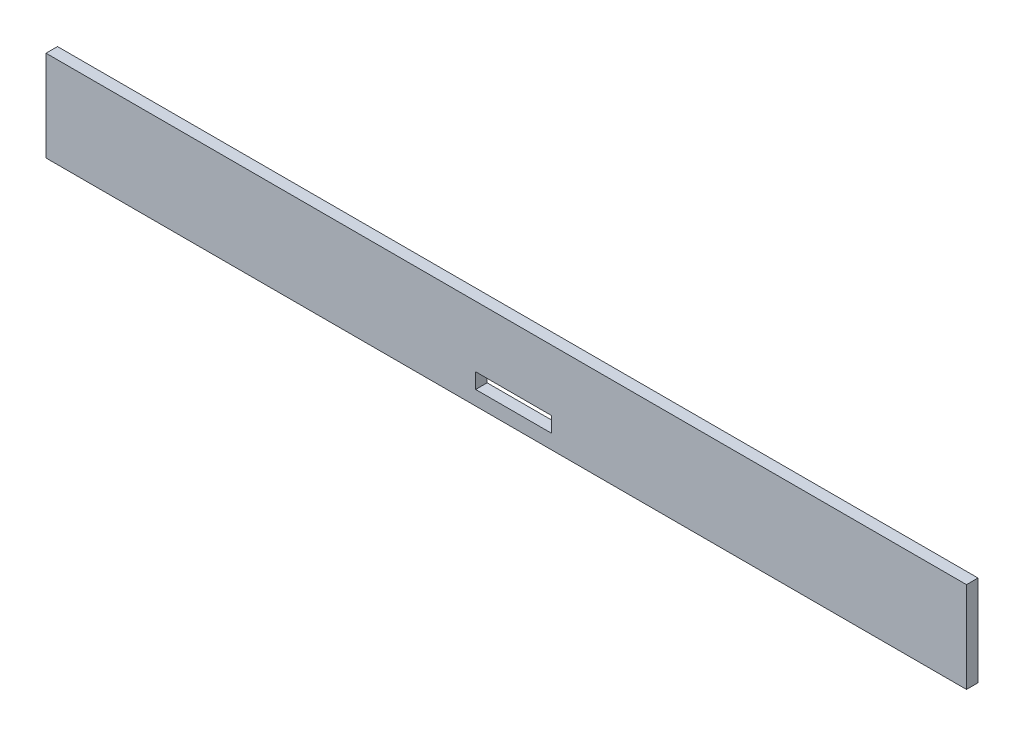
ISO-10303-21;
HEADER;
FILE_DESCRIPTION(('STEP AP214'),'2;1');
FILE_NAME('part.step','',(''),(''),'','','');
FILE_SCHEMA(('AUTOMOTIVE_DESIGN { 1 0 10303 214 1 1 1 1 }'));
ENDSEC;
DATA;
#1=APPLICATION_CONTEXT('core data for automotive mechanical design processes');
#2=APPLICATION_PROTOCOL_DEFINITION('international standard','automotive_design',2000,#1);
#3=PRODUCT_CONTEXT('',#1,'mechanical');
#4=PRODUCT('Part','Part','',(#3));
#5=PRODUCT_RELATED_PRODUCT_CATEGORY('part','',(#4));
#6=PRODUCT_DEFINITION_FORMATION('','',#4);
#7=PRODUCT_DEFINITION_CONTEXT('part definition',#1,'design');
#8=PRODUCT_DEFINITION('design','',#6,#7);
#9=PRODUCT_DEFINITION_SHAPE('','',#8);
#10=(LENGTH_UNIT() NAMED_UNIT(*) SI_UNIT(.MILLI.,.METRE.));
#11=(NAMED_UNIT(*) PLANE_ANGLE_UNIT() SI_UNIT($,.RADIAN.));
#12=(NAMED_UNIT(*) SI_UNIT($,.STERADIAN.) SOLID_ANGLE_UNIT());
#13=UNCERTAINTY_MEASURE_WITH_UNIT(LENGTH_MEASURE(1.E-05),#10,'distance_accuracy_value','');
#14=(GEOMETRIC_REPRESENTATION_CONTEXT(3) GLOBAL_UNCERTAINTY_ASSIGNED_CONTEXT((#13)) GLOBAL_UNIT_ASSIGNED_CONTEXT((#10,
#11,#12)) REPRESENTATION_CONTEXT('',''));
#15=CARTESIAN_POINT('',(0.,0.,0.));
#16=DIRECTION('',(0.,0.,1.));
#17=DIRECTION('',(1.,0.,0.));
#18=AXIS2_PLACEMENT_3D('',#15,#16,#17);
#19=CARTESIAN_POINT('',(0.,0.,2.54));
#20=DIRECTION('',(0.,0.,1.));
#21=DIRECTION('',(1.,0.,0.));
#22=AXIS2_PLACEMENT_3D('',#19,#20,#21);
#23=PLANE('',#22);
#24=DIRECTION('',(0.,-1.,0.));
#25=VECTOR('',#24,1.);
#26=CARTESIAN_POINT('',(0.,20.0406,2.54));
#27=LINE('',#26,#25);
#28=CARTESIAN_POINT('',(0.,20.0406,2.54));
#29=VERTEX_POINT('',#28);
#30=CARTESIAN_POINT('',(0.,0.,2.54));
#31=VERTEX_POINT('',#30);
#32=EDGE_CURVE('E153',#29,#31,#27,.T.);
#33=ORIENTED_EDGE('',*,*,#32,.T.);
#34=DIRECTION('',(1.,0.,0.));
#35=VECTOR('',#34,1.);
#36=CARTESIAN_POINT('',(0.,0.,2.54));
#37=LINE('',#36,#35);
#38=CARTESIAN_POINT('',(203.2,0.,2.54));
#39=VERTEX_POINT('',#38);
#40=EDGE_CURVE('E157',#31,#39,#37,.T.);
#41=ORIENTED_EDGE('',*,*,#40,.T.);
#42=DIRECTION('',(0.,1.,0.));
#43=VECTOR('',#42,1.);
#44=CARTESIAN_POINT('',(203.2,0.,2.54));
#45=LINE('',#44,#43);
#46=CARTESIAN_POINT('',(203.2,20.0406,2.54));
#47=VERTEX_POINT('',#46);
#48=EDGE_CURVE('E161',#39,#47,#45,.T.);
#49=ORIENTED_EDGE('',*,*,#48,.T.);
#50=DIRECTION('',(-1.,0.,0.));
#51=VECTOR('',#50,1.);
#52=CARTESIAN_POINT('',(203.2,20.0406,2.54));
#53=LINE('',#52,#51);
#54=EDGE_CURVE('E164',#47,#29,#53,.T.);
#55=ORIENTED_EDGE('',*,*,#54,.T.);
#56=EDGE_LOOP('',(#33,#41,#49,#55));
#57=FACE_BOUND('',#56,.T.);
#58=DIRECTION('',(0.,-1.,0.));
#59=VECTOR('',#58,1.);
#60=CARTESIAN_POINT('',(94.8465292801184,3.175,2.54));
#61=LINE('',#60,#59);
#62=CARTESIAN_POINT('',(94.8465292801184,6.56166666666667,2.54));
#63=VERTEX_POINT('',#62);
#64=CARTESIAN_POINT('',(94.8465292801184,3.175,2.54));
#65=VERTEX_POINT('',#64);
#66=EDGE_CURVE('E114',#63,#65,#61,.T.);
#67=ORIENTED_EDGE('',*,*,#66,.F.);
#68=DIRECTION('',(-1.,0.,0.));
#69=VECTOR('',#68,1.);
#70=CARTESIAN_POINT('',(94.8465292801184,6.56166666666667,2.54));
#71=LINE('',#70,#69);
#72=CARTESIAN_POINT('',(111.610529280118,6.56166666666667,2.54));
#73=VERTEX_POINT('',#72);
#74=EDGE_CURVE('E105',#73,#63,#71,.T.);
#75=ORIENTED_EDGE('',*,*,#74,.F.);
#76=DIRECTION('',(0.,1.,0.));
#77=VECTOR('',#76,1.);
#78=CARTESIAN_POINT('',(111.610529280118,6.56166666666667,2.54));
#79=LINE('',#78,#77);
#80=CARTESIAN_POINT('',(111.610529280118,3.175,2.54));
#81=VERTEX_POINT('',#80);
#82=EDGE_CURVE('E131',#81,#73,#79,.T.);
#83=ORIENTED_EDGE('',*,*,#82,.F.);
#84=DIRECTION('',(1.,0.,0.));
#85=VECTOR('',#84,1.);
#86=CARTESIAN_POINT('',(94.8465292801184,3.175,2.54));
#87=LINE('',#86,#85);
#88=EDGE_CURVE('E127',#65,#81,#87,.T.);
#89=ORIENTED_EDGE('',*,*,#88,.F.);
#90=EDGE_LOOP('',(#67,#75,#83,#89));
#91=FACE_BOUND('',#90,.T.);
#92=ADVANCED_FACE('F39',(#57,#91),#23,.T.);
#93=CARTESIAN_POINT('',(0.,0.,0.));
#94=DIRECTION('',(0.,0.,1.));
#95=DIRECTION('',(1.,0.,0.));
#96=AXIS2_PLACEMENT_3D('',#93,#94,#95);
#97=PLANE('',#96);
#98=DIRECTION('',(0.,-1.,0.));
#99=VECTOR('',#98,1.);
#100=CARTESIAN_POINT('',(0.,20.0406,0.));
#101=LINE('',#100,#99);
#102=CARTESIAN_POINT('',(0.,20.0406,0.));
#103=VERTEX_POINT('',#102);
#104=CARTESIAN_POINT('',(0.,0.,0.));
#105=VERTEX_POINT('',#104);
#106=EDGE_CURVE('E123',#103,#105,#101,.T.);
#107=ORIENTED_EDGE('',*,*,#106,.F.);
#108=DIRECTION('',(-1.,0.,0.));
#109=VECTOR('',#108,1.);
#110=CARTESIAN_POINT('',(203.2,20.0406,0.));
#111=LINE('',#110,#109);
#112=CARTESIAN_POINT('',(203.2,20.0406,0.));
#113=VERTEX_POINT('',#112);
#114=EDGE_CURVE('E158',#113,#103,#111,.T.);
#115=ORIENTED_EDGE('',*,*,#114,.F.);
#116=DIRECTION('',(0.,1.,0.));
#117=VECTOR('',#116,1.);
#118=CARTESIAN_POINT('',(203.2,0.,0.));
#119=LINE('',#118,#117);
#120=CARTESIAN_POINT('',(203.2,0.,0.));
#121=VERTEX_POINT('',#120);
#122=EDGE_CURVE('E174',#121,#113,#119,.T.);
#123=ORIENTED_EDGE('',*,*,#122,.F.);
#124=DIRECTION('',(1.,0.,0.));
#125=VECTOR('',#124,1.);
#126=CARTESIAN_POINT('',(0.,0.,0.));
#127=LINE('',#126,#125);
#128=EDGE_CURVE('E171',#105,#121,#127,.T.);
#129=ORIENTED_EDGE('',*,*,#128,.F.);
#130=EDGE_LOOP('',(#107,#115,#123,#129));
#131=FACE_BOUND('',#130,.T.);
#132=DIRECTION('',(-1.,0.,0.));
#133=VECTOR('',#132,1.);
#134=CARTESIAN_POINT('',(94.8465292801184,6.56166666666667,0.));
#135=LINE('',#134,#133);
#136=CARTESIAN_POINT('',(111.610529280118,6.56166666666667,0.));
#137=VERTEX_POINT('',#136);
#138=CARTESIAN_POINT('',(94.8465292801184,6.56166666666667,0.));
#139=VERTEX_POINT('',#138);
#140=EDGE_CURVE('E63',#137,#139,#135,.T.);
#141=ORIENTED_EDGE('',*,*,#140,.T.);
#142=DIRECTION('',(0.,-1.,0.));
#143=VECTOR('',#142,1.);
#144=CARTESIAN_POINT('',(94.8465292801184,3.175,0.));
#145=LINE('',#144,#143);
#146=CARTESIAN_POINT('',(94.8465292801184,3.175,0.));
#147=VERTEX_POINT('',#146);
#148=EDGE_CURVE('E121',#139,#147,#145,.T.);
#149=ORIENTED_EDGE('',*,*,#148,.T.);
#150=DIRECTION('',(1.,0.,0.));
#151=VECTOR('',#150,1.);
#152=CARTESIAN_POINT('',(94.8465292801184,3.175,0.));
#153=LINE('',#152,#151);
#154=CARTESIAN_POINT('',(111.610529280118,3.175,0.));
#155=VERTEX_POINT('',#154);
#156=EDGE_CURVE('E140',#147,#155,#153,.T.);
#157=ORIENTED_EDGE('',*,*,#156,.T.);
#158=DIRECTION('',(0.,1.,0.));
#159=VECTOR('',#158,1.);
#160=CARTESIAN_POINT('',(111.610529280118,6.56166666666667,0.));
#161=LINE('',#160,#159);
#162=EDGE_CURVE('E115',#155,#137,#161,.T.);
#163=ORIENTED_EDGE('',*,*,#162,.T.);
#164=EDGE_LOOP('',(#141,#149,#157,#163));
#165=FACE_BOUND('',#164,.T.);
#166=ADVANCED_FACE('F197',(#131,#165),#97,.F.);
#167=CARTESIAN_POINT('',(0.,20.0406,2.54));
#168=DIRECTION('',(1.,0.,0.));
#169=DIRECTION('',(0.,1.,0.));
#170=AXIS2_PLACEMENT_3D('',#167,#168,#169);
#171=PLANE('',#170);
#172=ORIENTED_EDGE('',*,*,#106,.T.);
#173=DIRECTION('',(0.,0.,-1.));
#174=VECTOR('',#173,1.);
#175=CARTESIAN_POINT('',(0.,0.,2.54));
#176=LINE('',#175,#174);
#177=EDGE_CURVE('E11',#31,#105,#176,.T.);
#178=ORIENTED_EDGE('',*,*,#177,.F.);
#179=ORIENTED_EDGE('',*,*,#32,.F.);
#180=DIRECTION('',(0.,0.,-1.));
#181=VECTOR('',#180,1.);
#182=CARTESIAN_POINT('',(0.,20.0406,2.54));
#183=LINE('',#182,#181);
#184=EDGE_CURVE('E167',#29,#103,#183,.T.);
#185=ORIENTED_EDGE('',*,*,#184,.T.);
#186=EDGE_LOOP('',(#172,#178,#179,#185));
#187=FACE_BOUND('',#186,.T.);
#188=ADVANCED_FACE('F41',(#187),#171,.F.);
#189=CARTESIAN_POINT('',(0.,0.,2.54));
#190=DIRECTION('',(0.,1.,0.));
#191=DIRECTION('',(0.,0.,1.));
#192=AXIS2_PLACEMENT_3D('',#189,#190,#191);
#193=PLANE('',#192);
#194=ORIENTED_EDGE('',*,*,#128,.T.);
#195=DIRECTION('',(0.,0.,-1.));
#196=VECTOR('',#195,1.);
#197=CARTESIAN_POINT('',(203.2,0.,2.54));
#198=LINE('',#197,#196);
#199=EDGE_CURVE('E48',#39,#121,#198,.T.);
#200=ORIENTED_EDGE('',*,*,#199,.F.);
#201=ORIENTED_EDGE('',*,*,#40,.F.);
#202=ORIENTED_EDGE('',*,*,#177,.T.);
#203=EDGE_LOOP('',(#194,#200,#201,#202));
#204=FACE_BOUND('',#203,.T.);
#205=ADVANCED_FACE('F207',(#204),#193,.F.);
#206=CARTESIAN_POINT('',(203.2,0.,2.54));
#207=DIRECTION('',(-1.,0.,0.));
#208=DIRECTION('',(0.,0.,1.));
#209=AXIS2_PLACEMENT_3D('',#206,#207,#208);
#210=PLANE('',#209);
#211=ORIENTED_EDGE('',*,*,#122,.T.);
#212=DIRECTION('',(0.,0.,-1.));
#213=VECTOR('',#212,1.);
#214=CARTESIAN_POINT('',(203.2,20.0406,2.54));
#215=LINE('',#214,#213);
#216=EDGE_CURVE('E182',#47,#113,#215,.T.);
#217=ORIENTED_EDGE('',*,*,#216,.F.);
#218=ORIENTED_EDGE('',*,*,#48,.F.);
#219=ORIENTED_EDGE('',*,*,#199,.T.);
#220=EDGE_LOOP('',(#211,#217,#218,#219));
#221=FACE_BOUND('',#220,.T.);
#222=ADVANCED_FACE('F191',(#221),#210,.F.);
#223=CARTESIAN_POINT('',(203.2,20.0406,2.54));
#224=DIRECTION('',(0.,-1.,0.));
#225=DIRECTION('',(1.,0.,0.));
#226=AXIS2_PLACEMENT_3D('',#223,#224,#225);
#227=PLANE('',#226);
#228=ORIENTED_EDGE('',*,*,#114,.T.);
#229=ORIENTED_EDGE('',*,*,#184,.F.);
#230=ORIENTED_EDGE('',*,*,#54,.F.);
#231=ORIENTED_EDGE('',*,*,#216,.T.);
#232=EDGE_LOOP('',(#228,#229,#230,#231));
#233=FACE_BOUND('',#232,.T.);
#234=ADVANCED_FACE('F201',(#233),#227,.F.);
#235=CARTESIAN_POINT('',(94.8465292801184,6.56166666666667,2.54));
#236=DIRECTION('',(0.,-1.,0.));
#237=DIRECTION('',(0.,0.,-1.));
#238=AXIS2_PLACEMENT_3D('',#235,#236,#237);
#239=PLANE('',#238);
#240=ORIENTED_EDGE('',*,*,#140,.F.);
#241=DIRECTION('',(0.,0.,-1.));
#242=VECTOR('',#241,1.);
#243=CARTESIAN_POINT('',(111.610529280118,6.56166666666667,2.54));
#244=LINE('',#243,#242);
#245=EDGE_CURVE('E109',#73,#137,#244,.T.);
#246=ORIENTED_EDGE('',*,*,#245,.F.);
#247=ORIENTED_EDGE('',*,*,#74,.T.);
#248=DIRECTION('',(0.,0.,-1.));
#249=VECTOR('',#248,1.);
#250=CARTESIAN_POINT('',(94.8465292801184,6.56166666666667,2.54));
#251=LINE('',#250,#249);
#252=EDGE_CURVE('E108',#63,#139,#251,.T.);
#253=ORIENTED_EDGE('',*,*,#252,.T.);
#254=EDGE_LOOP('',(#240,#246,#247,#253));
#255=FACE_BOUND('',#254,.T.);
#256=ADVANCED_FACE('F107',(#255),#239,.T.);
#257=CARTESIAN_POINT('',(94.8465292801184,3.175,2.54));
#258=DIRECTION('',(1.,0.,0.));
#259=DIRECTION('',(0.,0.,-1.));
#260=AXIS2_PLACEMENT_3D('',#257,#258,#259);
#261=PLANE('',#260);
#262=ORIENTED_EDGE('',*,*,#148,.F.);
#263=ORIENTED_EDGE('',*,*,#252,.F.);
#264=ORIENTED_EDGE('',*,*,#66,.T.);
#265=DIRECTION('',(0.,0.,-1.));
#266=VECTOR('',#265,1.);
#267=CARTESIAN_POINT('',(94.8465292801184,3.175,2.54));
#268=LINE('',#267,#266);
#269=EDGE_CURVE('E124',#65,#147,#268,.T.);
#270=ORIENTED_EDGE('',*,*,#269,.T.);
#271=EDGE_LOOP('',(#262,#263,#264,#270));
#272=FACE_BOUND('',#271,.T.);
#273=ADVANCED_FACE('F118',(#272),#261,.T.);
#274=CARTESIAN_POINT('',(94.8465292801184,3.175,2.54));
#275=DIRECTION('',(0.,1.,0.));
#276=DIRECTION('',(0.,0.,1.));
#277=AXIS2_PLACEMENT_3D('',#274,#275,#276);
#278=PLANE('',#277);
#279=ORIENTED_EDGE('',*,*,#156,.F.);
#280=ORIENTED_EDGE('',*,*,#269,.F.);
#281=ORIENTED_EDGE('',*,*,#88,.T.);
#282=DIRECTION('',(0.,0.,-1.));
#283=VECTOR('',#282,1.);
#284=CARTESIAN_POINT('',(111.610529280118,3.175,2.54));
#285=LINE('',#284,#283);
#286=EDGE_CURVE('E55',#81,#155,#285,.T.);
#287=ORIENTED_EDGE('',*,*,#286,.T.);
#288=EDGE_LOOP('',(#279,#280,#281,#287));
#289=FACE_BOUND('',#288,.T.);
#290=ADVANCED_FACE('F230',(#289),#278,.T.);
#291=CARTESIAN_POINT('',(111.610529280118,6.56166666666667,2.54));
#292=DIRECTION('',(-1.,0.,0.));
#293=DIRECTION('',(0.,0.,1.));
#294=AXIS2_PLACEMENT_3D('',#291,#292,#293);
#295=PLANE('',#294);
#296=ORIENTED_EDGE('',*,*,#162,.F.);
#297=ORIENTED_EDGE('',*,*,#286,.F.);
#298=ORIENTED_EDGE('',*,*,#82,.T.);
#299=ORIENTED_EDGE('',*,*,#245,.T.);
#300=EDGE_LOOP('',(#296,#297,#298,#299));
#301=FACE_BOUND('',#300,.T.);
#302=ADVANCED_FACE('F234',(#301),#295,.T.);
#303=CLOSED_SHELL('',(#92,#166,#188,#205,#222,#234,#256,#273,#290,#302));
#304=MANIFOLD_SOLID_BREP('B2',#303);
#305=ADVANCED_BREP_SHAPE_REPRESENTATION('',(#18,#304),#14);
#306=SHAPE_DEFINITION_REPRESENTATION(#9,#305);
ENDSEC;
END-ISO-10303-21;
